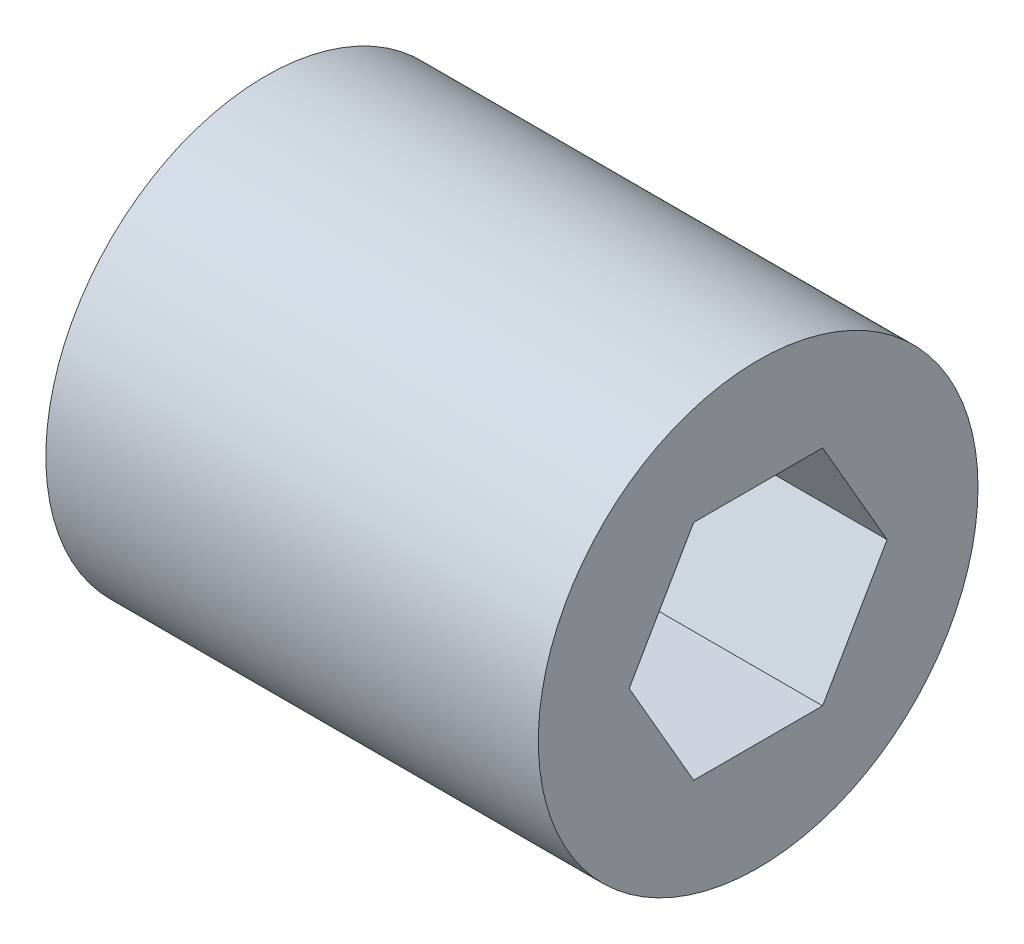
ISO-10303-21;
HEADER;
FILE_DESCRIPTION(('STEP AP214'),'2;1');
FILE_NAME('part.step','',(''),(''),'','','');
FILE_SCHEMA(('AUTOMOTIVE_DESIGN { 1 0 10303 214 1 1 1 1 }'));
ENDSEC;
DATA;
#1=APPLICATION_CONTEXT('core data for automotive mechanical design processes');
#2=APPLICATION_PROTOCOL_DEFINITION('international standard','automotive_design',2000,#1);
#3=PRODUCT_CONTEXT('',#1,'mechanical');
#4=PRODUCT('Part','Part','',(#3));
#5=PRODUCT_RELATED_PRODUCT_CATEGORY('part','',(#4));
#6=PRODUCT_DEFINITION_FORMATION('','',#4);
#7=PRODUCT_DEFINITION_CONTEXT('part definition',#1,'design');
#8=PRODUCT_DEFINITION('design','',#6,#7);
#9=PRODUCT_DEFINITION_SHAPE('','',#8);
#10=(LENGTH_UNIT() NAMED_UNIT(*) SI_UNIT(.MILLI.,.METRE.));
#11=(NAMED_UNIT(*) PLANE_ANGLE_UNIT() SI_UNIT($,.RADIAN.));
#12=(NAMED_UNIT(*) SI_UNIT($,.STERADIAN.) SOLID_ANGLE_UNIT());
#13=UNCERTAINTY_MEASURE_WITH_UNIT(LENGTH_MEASURE(1.E-05),#10,'distance_accuracy_value','');
#14=(GEOMETRIC_REPRESENTATION_CONTEXT(3) GLOBAL_UNCERTAINTY_ASSIGNED_CONTEXT((#13)) GLOBAL_UNIT_ASSIGNED_CONTEXT((#10,
#11,#12)) REPRESENTATION_CONTEXT('',''));
#15=CARTESIAN_POINT('',(0.,0.,0.));
#16=DIRECTION('',(0.,0.,1.));
#17=DIRECTION('',(1.,0.,0.));
#18=AXIS2_PLACEMENT_3D('',#15,#16,#17);
#19=CARTESIAN_POINT('',(28.,0.,0.));
#20=DIRECTION('',(1.,0.,0.));
#21=DIRECTION('',(0.,0.,-1.));
#22=AXIS2_PLACEMENT_3D('',#19,#20,#21);
#23=PLANE('',#22);
#24=CARTESIAN_POINT('',(28.,0.,0.));
#25=DIRECTION('',(1.,0.,0.));
#26=DIRECTION('',(0.,0.,-1.));
#27=AXIS2_PLACEMENT_3D('',#24,#25,#26);
#28=CIRCLE('',#27,12.5);
#29=CARTESIAN_POINT('',(28.,0.,-12.5));
#30=VERTEX_POINT('',#29);
#31=EDGE_CURVE('E11',#30,#30,#28,.T.);
#32=ORIENTED_EDGE('',*,*,#31,.T.);
#33=EDGE_LOOP('',(#32));
#34=FACE_BOUND('',#33,.T.);
#35=DIRECTION('',(0.,0.866025403784439,0.5));
#36=VECTOR('',#35,1.);
#37=CARTESIAN_POINT('',(28.,0.,-7.33234841870825));
#38=LINE('',#37,#36);
#39=CARTESIAN_POINT('',(28.,0.,-7.33234841870825));
#40=VERTEX_POINT('',#39);
#41=CARTESIAN_POINT('',(28.,6.35,-3.66617420935412));
#42=VERTEX_POINT('',#41);
#43=EDGE_CURVE('E102',#40,#42,#38,.T.);
#44=ORIENTED_EDGE('',*,*,#43,.F.);
#45=DIRECTION('',(0.,0.866025403784439,-0.5));
#46=VECTOR('',#45,1.);
#47=CARTESIAN_POINT('',(28.,-6.35,-3.66617420935412));
#48=LINE('',#47,#46);
#49=CARTESIAN_POINT('',(28.,-6.35,-3.66617420935412));
#50=VERTEX_POINT('',#49);
#51=EDGE_CURVE('E93',#50,#40,#48,.T.);
#52=ORIENTED_EDGE('',*,*,#51,.F.);
#53=DIRECTION('',(0.,0.,-1.));
#54=VECTOR('',#53,1.);
#55=CARTESIAN_POINT('',(28.,-6.35,3.66617420935412));
#56=LINE('',#55,#54);
#57=CARTESIAN_POINT('',(28.,-6.35,3.66617420935412));
#58=VERTEX_POINT('',#57);
#59=EDGE_CURVE('E127',#58,#50,#56,.T.);
#60=ORIENTED_EDGE('',*,*,#59,.F.);
#61=DIRECTION('',(0.,-0.866025403784439,-0.5));
#62=VECTOR('',#61,1.);
#63=CARTESIAN_POINT('',(28.,0.,7.33234841870825));
#64=LINE('',#63,#62);
#65=CARTESIAN_POINT('',(28.,0.,7.33234841870825));
#66=VERTEX_POINT('',#65);
#67=EDGE_CURVE('E124',#66,#58,#64,.T.);
#68=ORIENTED_EDGE('',*,*,#67,.F.);
#69=DIRECTION('',(0.,-0.866025403784438,0.5));
#70=VECTOR('',#69,1.);
#71=CARTESIAN_POINT('',(28.,6.35,3.66617420935412));
#72=LINE('',#71,#70);
#73=CARTESIAN_POINT('',(28.,6.35,3.66617420935412));
#74=VERTEX_POINT('',#73);
#75=EDGE_CURVE('E119',#74,#66,#72,.T.);
#76=ORIENTED_EDGE('',*,*,#75,.F.);
#77=DIRECTION('',(0.,0.,1.));
#78=VECTOR('',#77,1.);
#79=CARTESIAN_POINT('',(28.,6.35,-3.66617420935412));
#80=LINE('',#79,#78);
#81=EDGE_CURVE('E115',#42,#74,#80,.T.);
#82=ORIENTED_EDGE('',*,*,#81,.F.);
#83=EDGE_LOOP('',(#44,#52,#60,#68,#76,#82));
#84=FACE_BOUND('',#83,.T.);
#85=ADVANCED_FACE('F39',(#34,#84),#23,.T.);
#86=CARTESIAN_POINT('',(0.,0.,0.));
#87=DIRECTION('',(1.,0.,0.));
#88=DIRECTION('',(0.,0.,-1.));
#89=AXIS2_PLACEMENT_3D('',#86,#87,#88);
#90=PLANE('',#89);
#91=CARTESIAN_POINT('',(0.,0.,0.));
#92=DIRECTION('',(1.,0.,0.));
#93=DIRECTION('',(0.,0.,-1.));
#94=AXIS2_PLACEMENT_3D('',#91,#92,#93);
#95=CIRCLE('',#94,12.5);
#96=CARTESIAN_POINT('',(0.,0.,-12.5));
#97=VERTEX_POINT('',#96);
#98=EDGE_CURVE('E43',#97,#97,#95,.T.);
#99=ORIENTED_EDGE('',*,*,#98,.F.);
#100=EDGE_LOOP('',(#99));
#101=FACE_BOUND('',#100,.T.);
#102=DIRECTION('',(0.,0.866025403784439,-0.5));
#103=VECTOR('',#102,1.);
#104=CARTESIAN_POINT('',(0.,-6.35,-3.66617420935412));
#105=LINE('',#104,#103);
#106=CARTESIAN_POINT('',(0.,-6.35,-3.66617420935412));
#107=VERTEX_POINT('',#106);
#108=CARTESIAN_POINT('',(0.,0.,-7.33234841870825));
#109=VERTEX_POINT('',#108);
#110=EDGE_CURVE('E63',#107,#109,#105,.T.);
#111=ORIENTED_EDGE('',*,*,#110,.T.);
#112=DIRECTION('',(0.,0.866025403784439,0.5));
#113=VECTOR('',#112,1.);
#114=CARTESIAN_POINT('',(0.,0.,-7.33234841870825));
#115=LINE('',#114,#113);
#116=CARTESIAN_POINT('',(0.,6.35,-3.66617420935412));
#117=VERTEX_POINT('',#116);
#118=EDGE_CURVE('E109',#109,#117,#115,.T.);
#119=ORIENTED_EDGE('',*,*,#118,.T.);
#120=DIRECTION('',(0.,0.,1.));
#121=VECTOR('',#120,1.);
#122=CARTESIAN_POINT('',(0.,6.35,-3.66617420935412));
#123=LINE('',#122,#121);
#124=CARTESIAN_POINT('',(0.,6.35,3.66617420935412));
#125=VERTEX_POINT('',#124);
#126=EDGE_CURVE('E134',#117,#125,#123,.T.);
#127=ORIENTED_EDGE('',*,*,#126,.T.);
#128=DIRECTION('',(0.,-0.866025403784438,0.5));
#129=VECTOR('',#128,1.);
#130=CARTESIAN_POINT('',(0.,6.35,3.66617420935412));
#131=LINE('',#130,#129);
#132=CARTESIAN_POINT('',(0.,0.,7.33234841870825));
#133=VERTEX_POINT('',#132);
#134=EDGE_CURVE('E138',#125,#133,#131,.T.);
#135=ORIENTED_EDGE('',*,*,#134,.T.);
#136=DIRECTION('',(0.,-0.866025403784439,-0.5));
#137=VECTOR('',#136,1.);
#138=CARTESIAN_POINT('',(0.,0.,7.33234841870825));
#139=LINE('',#138,#137);
#140=CARTESIAN_POINT('',(0.,-6.35,3.66617420935412));
#141=VERTEX_POINT('',#140);
#142=EDGE_CURVE('E142',#133,#141,#139,.T.);
#143=ORIENTED_EDGE('',*,*,#142,.T.);
#144=DIRECTION('',(0.,0.,-1.));
#145=VECTOR('',#144,1.);
#146=CARTESIAN_POINT('',(0.,-6.35,3.66617420935412));
#147=LINE('',#146,#145);
#148=EDGE_CURVE('E103',#141,#107,#147,.T.);
#149=ORIENTED_EDGE('',*,*,#148,.T.);
#150=EDGE_LOOP('',(#111,#119,#127,#135,#143,#149));
#151=FACE_BOUND('',#150,.T.);
#152=ADVANCED_FACE('F166',(#101,#151),#90,.F.);
#153=CARTESIAN_POINT('',(28.,0.,0.));
#154=DIRECTION('',(-1.,0.,0.));
#155=DIRECTION('',(0.,0.,1.));
#156=AXIS2_PLACEMENT_3D('',#153,#154,#155);
#157=CYLINDRICAL_SURFACE('',#156,12.5);
#158=ORIENTED_EDGE('',*,*,#31,.F.);
#159=EDGE_LOOP('',(#158));
#160=FACE_BOUND('',#159,.T.);
#161=ORIENTED_EDGE('',*,*,#98,.T.);
#162=EDGE_LOOP('',(#161));
#163=FACE_BOUND('',#162,.T.);
#164=ADVANCED_FACE('F41',(#160,#163),#157,.T.);
#165=CARTESIAN_POINT('',(28.,-6.35,-3.66617420935412));
#166=DIRECTION('',(0.,0.5,0.866025403784439));
#167=DIRECTION('',(0.,-0.866025403784439,0.5));
#168=AXIS2_PLACEMENT_3D('',#165,#166,#167);
#169=PLANE('',#168);
#170=ORIENTED_EDGE('',*,*,#110,.F.);
#171=DIRECTION('',(-1.,0.,0.));
#172=VECTOR('',#171,1.);
#173=CARTESIAN_POINT('',(28.,-6.35,-3.66617420935412));
#174=LINE('',#173,#172);
#175=EDGE_CURVE('E97',#50,#107,#174,.T.);
#176=ORIENTED_EDGE('',*,*,#175,.F.);
#177=ORIENTED_EDGE('',*,*,#51,.T.);
#178=DIRECTION('',(-1.,0.,0.));
#179=VECTOR('',#178,1.);
#180=CARTESIAN_POINT('',(28.,0.,-7.33234841870825));
#181=LINE('',#180,#179);
#182=EDGE_CURVE('E96',#40,#109,#181,.T.);
#183=ORIENTED_EDGE('',*,*,#182,.T.);
#184=EDGE_LOOP('',(#170,#176,#177,#183));
#185=FACE_BOUND('',#184,.T.);
#186=ADVANCED_FACE('F95',(#185),#169,.T.);
#187=CARTESIAN_POINT('',(28.,0.,-7.33234841870825));
#188=DIRECTION('',(0.,-0.5,0.866025403784439));
#189=DIRECTION('',(0.,-0.866025403784439,-0.5));
#190=AXIS2_PLACEMENT_3D('',#187,#188,#189);
#191=PLANE('',#190);
#192=ORIENTED_EDGE('',*,*,#118,.F.);
#193=ORIENTED_EDGE('',*,*,#182,.F.);
#194=ORIENTED_EDGE('',*,*,#43,.T.);
#195=DIRECTION('',(-1.,0.,0.));
#196=VECTOR('',#195,1.);
#197=CARTESIAN_POINT('',(28.,6.35,-3.66617420935412));
#198=LINE('',#197,#196);
#199=EDGE_CURVE('E111',#42,#117,#198,.T.);
#200=ORIENTED_EDGE('',*,*,#199,.T.);
#201=EDGE_LOOP('',(#192,#193,#194,#200));
#202=FACE_BOUND('',#201,.T.);
#203=ADVANCED_FACE('F106',(#202),#191,.T.);
#204=CARTESIAN_POINT('',(28.,6.35,-3.66617420935412));
#205=DIRECTION('',(0.,-1.,0.));
#206=DIRECTION('',(0.,0.,-1.));
#207=AXIS2_PLACEMENT_3D('',#204,#205,#206);
#208=PLANE('',#207);
#209=ORIENTED_EDGE('',*,*,#126,.F.);
#210=ORIENTED_EDGE('',*,*,#199,.F.);
#211=ORIENTED_EDGE('',*,*,#81,.T.);
#212=DIRECTION('',(-1.,0.,0.));
#213=VECTOR('',#212,1.);
#214=CARTESIAN_POINT('',(28.,6.35,3.66617420935412));
#215=LINE('',#214,#213);
#216=EDGE_CURVE('E156',#74,#125,#215,.T.);
#217=ORIENTED_EDGE('',*,*,#216,.T.);
#218=EDGE_LOOP('',(#209,#210,#211,#217));
#219=FACE_BOUND('',#218,.T.);
#220=ADVANCED_FACE('F162',(#219),#208,.T.);
#221=CARTESIAN_POINT('',(28.,6.35,3.66617420935412));
#222=DIRECTION('',(0.,-0.5,-0.866025403784438));
#223=DIRECTION('',(0.,0.866025403784439,-0.5));
#224=AXIS2_PLACEMENT_3D('',#221,#222,#223);
#225=PLANE('',#224);
#226=ORIENTED_EDGE('',*,*,#134,.F.);
#227=ORIENTED_EDGE('',*,*,#216,.F.);
#228=ORIENTED_EDGE('',*,*,#75,.T.);
#229=DIRECTION('',(-1.,0.,0.));
#230=VECTOR('',#229,1.);
#231=CARTESIAN_POINT('',(28.,0.,7.33234841870825));
#232=LINE('',#231,#230);
#233=EDGE_CURVE('E153',#66,#133,#232,.T.);
#234=ORIENTED_EDGE('',*,*,#233,.T.);
#235=EDGE_LOOP('',(#226,#227,#228,#234));
#236=FACE_BOUND('',#235,.T.);
#237=ADVANCED_FACE('F174',(#236),#225,.T.);
#238=CARTESIAN_POINT('',(28.,0.,7.33234841870825));
#239=DIRECTION('',(0.,0.5,-0.866025403784439));
#240=DIRECTION('',(0.,0.866025403784439,0.5));
#241=AXIS2_PLACEMENT_3D('',#238,#239,#240);
#242=PLANE('',#241);
#243=ORIENTED_EDGE('',*,*,#142,.F.);
#244=ORIENTED_EDGE('',*,*,#233,.F.);
#245=ORIENTED_EDGE('',*,*,#67,.T.);
#246=DIRECTION('',(-1.,0.,0.));
#247=VECTOR('',#246,1.);
#248=CARTESIAN_POINT('',(28.,-6.35,3.66617420935412));
#249=LINE('',#248,#247);
#250=EDGE_CURVE('E55',#58,#141,#249,.T.);
#251=ORIENTED_EDGE('',*,*,#250,.T.);
#252=EDGE_LOOP('',(#243,#244,#245,#251));
#253=FACE_BOUND('',#252,.T.);
#254=ADVANCED_FACE('F172',(#253),#242,.T.);
#255=CARTESIAN_POINT('',(28.,-6.35,3.66617420935412));
#256=DIRECTION('',(0.,1.,0.));
#257=DIRECTION('',(0.,0.,1.));
#258=AXIS2_PLACEMENT_3D('',#255,#256,#257);
#259=PLANE('',#258);
#260=ORIENTED_EDGE('',*,*,#148,.F.);
#261=ORIENTED_EDGE('',*,*,#250,.F.);
#262=ORIENTED_EDGE('',*,*,#59,.T.);
#263=ORIENTED_EDGE('',*,*,#175,.T.);
#264=EDGE_LOOP('',(#260,#261,#262,#263));
#265=FACE_BOUND('',#264,.T.);
#266=ADVANCED_FACE('F168',(#265),#259,.T.);
#267=CLOSED_SHELL('',(#85,#152,#164,#186,#203,#220,#237,#254,#266));
#268=MANIFOLD_SOLID_BREP('B2',#267);
#269=ADVANCED_BREP_SHAPE_REPRESENTATION('',(#18,#268),#14);
#270=SHAPE_DEFINITION_REPRESENTATION(#9,#269);
ENDSEC;
END-ISO-10303-21;
